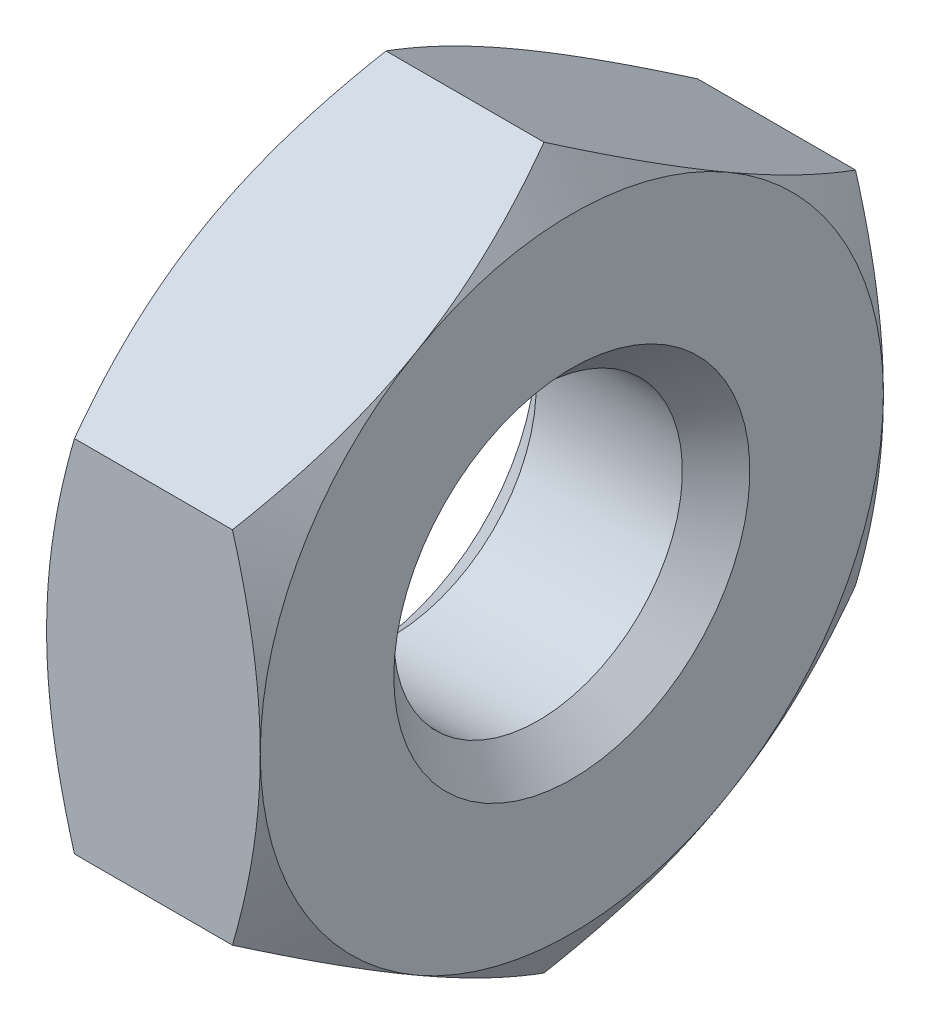
ISO-10303-21;
HEADER;
FILE_DESCRIPTION(('STEP AP214'),'2;1');
FILE_NAME('part.step','',(''),(''),'','','');
FILE_SCHEMA(('AUTOMOTIVE_DESIGN { 1 0 10303 214 1 1 1 1 }'));
ENDSEC;
DATA;
#1=APPLICATION_CONTEXT('core data for automotive mechanical design processes');
#2=APPLICATION_PROTOCOL_DEFINITION('international standard','automotive_design',2000,#1);
#3=PRODUCT_CONTEXT('',#1,'mechanical');
#4=PRODUCT('Part','Part','',(#3));
#5=PRODUCT_RELATED_PRODUCT_CATEGORY('part','',(#4));
#6=PRODUCT_DEFINITION_FORMATION('','',#4);
#7=PRODUCT_DEFINITION_CONTEXT('part definition',#1,'design');
#8=PRODUCT_DEFINITION('design','',#6,#7);
#9=PRODUCT_DEFINITION_SHAPE('','',#8);
#10=(LENGTH_UNIT() NAMED_UNIT(*) SI_UNIT(.MILLI.,.METRE.));
#11=(NAMED_UNIT(*) PLANE_ANGLE_UNIT() SI_UNIT($,.RADIAN.));
#12=(NAMED_UNIT(*) SI_UNIT($,.STERADIAN.) SOLID_ANGLE_UNIT());
#13=UNCERTAINTY_MEASURE_WITH_UNIT(LENGTH_MEASURE(1.E-05),#10,'distance_accuracy_value','');
#14=(GEOMETRIC_REPRESENTATION_CONTEXT(3) GLOBAL_UNCERTAINTY_ASSIGNED_CONTEXT((#13)) GLOBAL_UNIT_ASSIGNED_CONTEXT((#10,
#11,#12)) REPRESENTATION_CONTEXT('',''));
#15=CARTESIAN_POINT('',(0.,0.,0.));
#16=DIRECTION('',(0.,0.,1.));
#17=DIRECTION('',(1.,0.,0.));
#18=AXIS2_PLACEMENT_3D('',#15,#16,#17);
#19=CARTESIAN_POINT('',(-1.2,0.,0.));
#20=DIRECTION('',(1.,0.,0.));
#21=DIRECTION('',(0.,0.,-1.));
#22=AXIS2_PLACEMENT_3D('',#19,#20,#21);
#23=PLANE('',#22);
#24=CARTESIAN_POINT('',(-1.2,0.,0.));
#25=DIRECTION('',(-1.,0.,0.));
#26=DIRECTION('',(0.,0.,1.));
#27=AXIS2_PLACEMENT_3D('',#24,#25,#26);
#28=CIRCLE('',#27,3.5);
#29=CARTESIAN_POINT('',(-1.2,0.,3.5));
#30=VERTEX_POINT('',#29);
#31=CARTESIAN_POINT('',(-1.2,3.03108891324554,1.75));
#32=VERTEX_POINT('',#31);
#33=EDGE_CURVE('E11',#30,#32,#28,.T.);
#34=ORIENTED_EDGE('',*,*,#33,.T.);
#35=CARTESIAN_POINT('',(-1.2,3.03108891324554,-1.75));
#36=VERTEX_POINT('',#35);
#37=EDGE_CURVE('E43',#32,#36,#28,.T.);
#38=ORIENTED_EDGE('',*,*,#37,.T.);
#39=CARTESIAN_POINT('',(-1.2,0.,-3.5));
#40=VERTEX_POINT('',#39);
#41=EDGE_CURVE('E339',#36,#40,#28,.T.);
#42=ORIENTED_EDGE('',*,*,#41,.T.);
#43=CARTESIAN_POINT('',(-1.2,-3.03108891324554,-1.75));
#44=VERTEX_POINT('',#43);
#45=EDGE_CURVE('E337',#40,#44,#28,.T.);
#46=ORIENTED_EDGE('',*,*,#45,.T.);
#47=CARTESIAN_POINT('',(-1.2,-3.03108891324554,1.75));
#48=VERTEX_POINT('',#47);
#49=EDGE_CURVE('E332',#44,#48,#28,.T.);
#50=ORIENTED_EDGE('',*,*,#49,.T.);
#51=EDGE_CURVE('E44',#48,#30,#28,.T.);
#52=ORIENTED_EDGE('',*,*,#51,.T.);
#53=EDGE_LOOP('',(#34,#38,#42,#46,#50,#52));
#54=FACE_BOUND('',#53,.T.);
#55=CARTESIAN_POINT('',(-1.2,0.,0.));
#56=DIRECTION('',(-1.,0.,0.));
#57=DIRECTION('',(0.,0.,1.));
#58=AXIS2_PLACEMENT_3D('',#55,#56,#57);
#59=CIRCLE('',#58,2.);
#60=CARTESIAN_POINT('',(-1.2,0.,2.));
#61=VERTEX_POINT('',#60);
#62=EDGE_CURVE('E141',#61,#61,#59,.T.);
#63=ORIENTED_EDGE('',*,*,#62,.F.);
#64=EDGE_LOOP('',(#63));
#65=FACE_BOUND('',#64,.T.);
#66=ADVANCED_FACE('F36',(#54,#65),#23,.F.);
#67=CARTESIAN_POINT('',(1.2,3.5,0.));
#68=DIRECTION('',(-1.,0.,0.));
#69=DIRECTION('',(0.,0.,1.));
#70=AXIS2_PLACEMENT_3D('',#67,#68,#69);
#71=PLANE('',#70);
#72=CARTESIAN_POINT('',(1.2,0.,0.));
#73=DIRECTION('',(-1.,0.,0.));
#74=DIRECTION('',(0.,0.,1.));
#75=AXIS2_PLACEMENT_3D('',#72,#73,#74);
#76=CIRCLE('',#75,3.5);
#77=CARTESIAN_POINT('',(1.2,0.,3.5));
#78=VERTEX_POINT('',#77);
#79=CARTESIAN_POINT('',(1.2,3.03108891324554,1.75));
#80=VERTEX_POINT('',#79);
#81=EDGE_CURVE('E288',#78,#80,#76,.T.);
#82=ORIENTED_EDGE('',*,*,#81,.F.);
#83=CARTESIAN_POINT('',(1.2,-3.03108891324554,1.75));
#84=VERTEX_POINT('',#83);
#85=EDGE_CURVE('E278',#84,#78,#76,.T.);
#86=ORIENTED_EDGE('',*,*,#85,.F.);
#87=CARTESIAN_POINT('',(1.2,-3.03108891324554,-1.75));
#88=VERTEX_POINT('',#87);
#89=EDGE_CURVE('E284',#88,#84,#76,.T.);
#90=ORIENTED_EDGE('',*,*,#89,.F.);
#91=CARTESIAN_POINT('',(1.2,0.,-3.5));
#92=VERTEX_POINT('',#91);
#93=EDGE_CURVE('E290',#92,#88,#76,.T.);
#94=ORIENTED_EDGE('',*,*,#93,.F.);
#95=CARTESIAN_POINT('',(1.2,3.03108891324554,-1.75));
#96=VERTEX_POINT('',#95);
#97=EDGE_CURVE('E291',#96,#92,#76,.T.);
#98=ORIENTED_EDGE('',*,*,#97,.F.);
#99=EDGE_CURVE('E292',#80,#96,#76,.T.);
#100=ORIENTED_EDGE('',*,*,#99,.F.);
#101=EDGE_LOOP('',(#82,#86,#90,#94,#98,#100));
#102=FACE_BOUND('',#101,.T.);
#103=CARTESIAN_POINT('',(1.2,0.,0.));
#104=DIRECTION('',(-1.,0.,0.));
#105=DIRECTION('',(0.,0.,1.));
#106=AXIS2_PLACEMENT_3D('',#103,#104,#105);
#107=CIRCLE('',#106,2.);
#108=CARTESIAN_POINT('',(1.2,0.,2.));
#109=VERTEX_POINT('',#108);
#110=EDGE_CURVE('E620',#109,#109,#107,.T.);
#111=ORIENTED_EDGE('',*,*,#110,.T.);
#112=EDGE_LOOP('',(#111));
#113=FACE_BOUND('',#112,.T.);
#114=ADVANCED_FACE('F172',(#102,#113),#71,.F.);
#115=CARTESIAN_POINT('',(-0.795854811567261,0.,0.));
#116=DIRECTION('',(1.,0.,0.));
#117=DIRECTION('',(0.,0.,-1.));
#118=AXIS2_PLACEMENT_3D('',#115,#116,#117);
#119=CONICAL_SURFACE('',#118,4.2,1.0471975511966);
#120=CARTESIAN_POINT('',(0.480988086259848,-5.37196986632305,-3.5));
#121=CARTESIAN_POINT('',(0.407283508786786,-5.21956229872807,-3.5));
#122=CARTESIAN_POINT('',(0.334302028621978,-5.06679879227545,-3.5));
#123=CARTESIAN_POINT('',(0.190193119787068,-4.7603703949844,-3.5));
#124=CARTESIAN_POINT('',(0.119065994901097,-4.60670536144476,-3.5));
#125=CARTESIAN_POINT('',(-0.0212962646167795,-4.29746545873837,-3.5));
#126=CARTESIAN_POINT('',(-0.0905184858942326,-4.14188470744051,-3.5));
#127=CARTESIAN_POINT('',(-0.226054294481621,-3.82946600083052,-3.5));
#128=CARTESIAN_POINT('',(-0.292368023157458,-3.67262810706043,-3.5));
#129=CARTESIAN_POINT('',(-0.423298105104402,-3.35260353945911,-3.5));
#130=CARTESIAN_POINT('',(-0.487799913704983,-3.18936973939843,-3.5));
#131=CARTESIAN_POINT('',(-0.611784853293828,-2.8609718128924,-3.5));
#132=CARTESIAN_POINT('',(-0.671267413299659,-2.69580746925786,-3.5));
#133=CARTESIAN_POINT('',(-0.783611168590104,-2.36361344486693,-3.5));
#134=CARTESIAN_POINT('',(-0.836486267944157,-2.19658851504802,-3.5));
#135=CARTESIAN_POINT('',(-0.933881607500532,-1.860143848,-3.5));
#136=CARTESIAN_POINT('',(-0.97840453942322,-1.69072490130334,-3.5));
#137=CARTESIAN_POINT('',(-1.05668874987123,-1.35032578084445,-3.5));
#138=CARTESIAN_POINT('',(-1.09050625247354,-1.17935878378483,-3.5));
#139=CARTESIAN_POINT('',(-1.1454299454845,-0.835358711580522,-3.5));
#140=CARTESIAN_POINT('',(-1.16653722800651,-0.662325815249527,-3.5));
#141=CARTESIAN_POINT('',(-1.19407939926803,-0.317293925963925,-3.5));
#142=CARTESIAN_POINT('',(-1.20069844646934,-0.145310003142864,-3.5));
#143=CARTESIAN_POINT('',(-1.19918442101375,0.198604964977063,-3.5));
#144=CARTESIAN_POINT('',(-1.19105094478675,0.370536008700681,-3.5));
#145=CARTESIAN_POINT('',(-1.16513400901782,0.664116489402586,-3.5));
#146=CARTESIAN_POINT('',(-1.15077510101717,0.786085309438428,-3.5));
#147=CARTESIAN_POINT('',(-1.11555791787667,1.02908758010431,-3.5));
#148=CARTESIAN_POINT('',(-1.09469871046115,1.15012089401034,-3.5));
#149=CARTESIAN_POINT('',(-1.02347160339957,1.51168058473927,-3.5));
#150=CARTESIAN_POINT('',(-0.964468594491871,1.75052251621997,-3.5));
#151=CARTESIAN_POINT('',(-0.862699530257054,2.10757914173379,-3.5));
#152=CARTESIAN_POINT('',(-0.826106263684609,2.22765807986732,-3.5));
#153=CARTESIAN_POINT('',(-0.749254921128682,2.46664869406854,-3.5));
#154=CARTESIAN_POINT('',(-0.708996821775749,2.58556036268759,-3.5));
#155=CARTESIAN_POINT('',(-0.625450515881703,2.82225678707793,-3.5));
#156=CARTESIAN_POINT('',(-0.582163398110058,2.94004193064585,-3.5));
#157=CARTESIAN_POINT('',(-0.493054458105272,3.17464554572882,-3.5));
#158=CARTESIAN_POINT('',(-0.447232659301594,3.29146402616782,-3.5));
#159=CARTESIAN_POINT('',(-0.340420409465957,3.55666494412485,-3.5));
#160=CARTESIAN_POINT('',(-0.278759648230463,3.70477685888708,-3.5));
#161=CARTESIAN_POINT('',(-0.152676639626143,3.99982322200438,-3.5));
#162=CARTESIAN_POINT('',(-0.0882542590232543,4.14675761314309,-3.5));
#163=CARTESIAN_POINT('',(0.108341413973783,4.58612473076338,-3.5));
#164=CARTESIAN_POINT('',(0.243824188724422,4.87707514102806,-3.5));
#165=CARTESIAN_POINT('',(0.520760366823535,5.45640845489744,-3.5));
#166=CARTESIAN_POINT('',(0.662218955769723,5.74478885423415,-3.5));
#167=CARTESIAN_POINT('',(0.949225393039628,6.31951440902778,-3.5));
#168=CARTESIAN_POINT('',(1.09477337670376,6.60585949673122,-3.5));
#169=CARTESIAN_POINT('',(1.37734405966205,7.15478235363293,-3.5));
#170=CARTESIAN_POINT('',(1.51414731094802,7.41747346198053,-3.5));
#171=CARTESIAN_POINT('',(1.78964637345324,7.94187006515259,-3.5));
#172=CARTESIAN_POINT('',(1.92834223976776,8.20357553100017,-3.5));
#173=CARTESIAN_POINT('',(2.20688099780863,8.72563501839554,-3.5));
#174=CARTESIAN_POINT('',(2.34672069593944,8.98599074633557,-3.5));
#175=CARTESIAN_POINT('',(2.62754959638331,9.50606534442601,-3.5));
#176=CARTESIAN_POINT('',(2.76853874214416,9.76578424509992,-3.5));
#177=CARTESIAN_POINT('',(2.90996058564116,10.0252656776079,-3.5));
#178=B_SPLINE_CURVE_WITH_KNOTS('',3,(#120,#121,#122,#123,#124,#125,#126,#127,#128,#129,#130,
#131,#132,#133,#134,#135,#136,#137,#138,#139,#140,#141,#142,#143,#144,#145,#146,#147,#148,#149,
#150,#151,#152,#153,#154,#155,#156,#157,#158,#159,#160,#161,#162,#163,#164,#165,#166,#167,#168,
#169,#170,#171,#172,#173,#174,#175,#176,#177),.UNSPECIFIED.,.F.,.F.,(4,2,2,2,2,2,2,2,2,2,2,2,2,
2,2,2,2,2,2,2,2,2,2,2,2,2,2,2,4),(0.,0.507888246703566,1.01585918038805,1.52669129945674,
2.03749856219543,2.56398187130408,3.09052499187288,3.61594075148652,4.14118688912341,
4.66362686194865,5.18602193821682,5.70173737934552,6.21746692860129,6.58572052685437,
6.95402696451952,7.69107260984486,8.06763539279987,8.44420057714208,8.82063109500092,
9.19705813388496,9.67832437928781,10.1596138695236,11.1223428649373,12.0859251699099,
13.0495394027373,13.9380661095811,14.8266187374343,15.7132171301892,16.5997721628952),.UNSPECIFIED.);
#179=CARTESIAN_POINT('',(-0.887392608830356,-2.02072594216369,-3.5));
#180=VERTEX_POINT('',#179);
#181=EDGE_CURVE('E348',#180,#40,#178,.T.);
#182=ORIENTED_EDGE('',*,*,#181,.F.);
#183=CARTESIAN_POINT('',(-0.887325939306629,-4.04156735438122,0.000200000000000053));
#184=CARTESIAN_POINT('',(-0.938614211010016,-3.9527667384984,-0.15360717845245));
#185=CARTESIAN_POINT('',(-0.985259046183803,-3.86319960126198,-0.308742010834424));
#186=CARTESIAN_POINT('',(-1.06667812446665,-3.68251437287562,-0.621698006576781));
#187=CARTESIAN_POINT('',(-1.10142356441544,-3.59139307116725,-0.779524730787496));
#188=CARTESIAN_POINT('',(-1.15550997281716,-3.41027974688034,-1.09322221038013));
#189=CARTESIAN_POINT('',(-1.17521091373962,-3.32031559103708,-1.24904469916069));
#190=CARTESIAN_POINT('',(-1.19872986726275,-3.13996396008051,-1.56142288720537));
#191=CARTESIAN_POINT('',(-1.20256735545444,-3.04957714051106,-1.71797745103423));
#192=CARTESIAN_POINT('',(-1.19458469812302,-2.88068384499777,-2.01050921992099));
#193=CARTESIAN_POINT('',(-1.18472456593039,-2.80215208834114,-2.14653021245791));
#194=CARTESIAN_POINT('',(-1.1534735331006,-2.64560020969753,-2.417686020289));
#195=CARTESIAN_POINT('',(-1.1320719567142,-2.5675806292065,-2.55281989768468));
#196=CARTESIAN_POINT('',(-1.07856959211942,-2.41070596159678,-2.82453479240518));
#197=CARTESIAN_POINT('',(-1.04624200555491,-2.33187072981463,-2.96108141927834));
#198=CARTESIAN_POINT('',(-0.972871066192005,-2.17537608630783,-3.2321380929445));
#199=CARTESIAN_POINT('',(-0.931844953430133,-2.09771466960098,-3.36665161246854));
#200=CARTESIAN_POINT('',(-0.887325939306629,-2.02061047210985,-3.5002));
#201=B_SPLINE_CURVE_WITH_KNOTS('',3,(#183,#184,#185,#186,#187,#188,#189,#190,#191,#192,#193,
#194,#195,#196,#197,#198,#199,#200),.UNSPECIFIED.,.F.,.F.,(4,2,2,2,2,2,2,2,4),(0.,
0.554793832886254,1.11092123814984,1.65328467083219,2.19498204478403,2.6666513085086,
3.13875761298267,3.6213361260051,4.10296698719187),.UNSPECIFIED.);
#202=EDGE_CURVE('E190',#44,#180,#201,.T.);
#203=ORIENTED_EDGE('',*,*,#202,.F.);
#204=ORIENTED_EDGE('',*,*,#45,.F.);
#205=EDGE_LOOP('',(#182,#203,#204));
#206=FACE_BOUND('',#205,.T.);
#207=ADVANCED_FACE('F168',(#206),#119,.T.);
#208=CARTESIAN_POINT('',(-0.887392608830356,2.02072594216369,-3.5));
#209=VERTEX_POINT('',#208);
#210=EDGE_CURVE('E198',#40,#209,#178,.T.);
#211=ORIENTED_EDGE('',*,*,#210,.F.);
#212=ORIENTED_EDGE('',*,*,#41,.F.);
#213=CARTESIAN_POINT('',(-0.887325939306629,2.02061047210985,-3.5002));
#214=CARTESIAN_POINT('',(-0.938614211010017,2.10941108799267,-3.34639282154755));
#215=CARTESIAN_POINT('',(-0.985259046183803,2.19897822522909,-3.19125798916558));
#216=CARTESIAN_POINT('',(-1.06667812446665,2.37966345361545,-2.87830199342322));
#217=CARTESIAN_POINT('',(-1.10142356441544,2.47078475532382,-2.7204752692125));
#218=CARTESIAN_POINT('',(-1.15550997281716,2.65189807961073,-2.40677778961987));
#219=CARTESIAN_POINT('',(-1.17521091373962,2.74186223545399,-2.25095530083931));
#220=CARTESIAN_POINT('',(-1.19872986726275,2.92221386641056,-1.93857711279463));
#221=CARTESIAN_POINT('',(-1.20256735545444,3.01260068598001,-1.78202254896577));
#222=CARTESIAN_POINT('',(-1.19458469812302,3.1814939814933,-1.48949078007901));
#223=CARTESIAN_POINT('',(-1.18472456593039,3.26002573814993,-1.35346978754209));
#224=CARTESIAN_POINT('',(-1.1534735331006,3.41657761679354,-1.08231397971101));
#225=CARTESIAN_POINT('',(-1.1320719567142,3.49459719728458,-0.947180102315317));
#226=CARTESIAN_POINT('',(-1.07856959211942,3.65147186489429,-0.675465207594816));
#227=CARTESIAN_POINT('',(-1.04624200555491,3.73030709667644,-0.538918580721664));
#228=CARTESIAN_POINT('',(-0.972871066192006,3.88680174018324,-0.267861907055498));
#229=CARTESIAN_POINT('',(-0.931844953430133,3.96446315689009,-0.133348387531463));
#230=CARTESIAN_POINT('',(-0.887325939306629,4.04156735438122,0.000199999999999892));
#231=B_SPLINE_CURVE_WITH_KNOTS('',3,(#213,#214,#215,#216,#217,#218,#219,#220,#221,#222,#223,
#224,#225,#226,#227,#228,#229,#230),.UNSPECIFIED.,.F.,.F.,(4,2,2,2,2,2,2,2,4),(0.,
0.554793832886254,1.11092123814984,1.65328467083219,2.19498204478403,2.6666513085086,
3.13875761298267,3.6213361260051,4.10296698719187),.UNSPECIFIED.);
#232=EDGE_CURVE('E213',#209,#36,#231,.T.);
#233=ORIENTED_EDGE('',*,*,#232,.F.);
#234=EDGE_LOOP('',(#211,#212,#233));
#235=FACE_BOUND('',#234,.T.);
#236=ADVANCED_FACE('F171',(#235),#119,.T.);
#237=CARTESIAN_POINT('',(-0.887392608830357,4.04145188432738,0.));
#238=VERTEX_POINT('',#237);
#239=EDGE_CURVE('E206',#36,#238,#231,.T.);
#240=ORIENTED_EDGE('',*,*,#239,.F.);
#241=ORIENTED_EDGE('',*,*,#37,.F.);
#242=CARTESIAN_POINT('',(-0.887325939306629,4.04156735438122,-0.000200000000000053));
#243=CARTESIAN_POINT('',(-0.938614211010016,3.9527667384984,0.15360717845245));
#244=CARTESIAN_POINT('',(-0.985259046183803,3.86319960126198,0.308742010834424));
#245=CARTESIAN_POINT('',(-1.06667812446665,3.68251437287562,0.621698006576781));
#246=CARTESIAN_POINT('',(-1.10142356441544,3.59139307116725,0.779524730787496));
#247=CARTESIAN_POINT('',(-1.15550997281716,3.41027974688034,1.09322221038013));
#248=CARTESIAN_POINT('',(-1.17521091373962,3.32031559103708,1.24904469916069));
#249=CARTESIAN_POINT('',(-1.19872986726275,3.13996396008051,1.56142288720537));
#250=CARTESIAN_POINT('',(-1.20256735545444,3.04957714051106,1.71797745103423));
#251=CARTESIAN_POINT('',(-1.19458469812302,2.88068384499777,2.01050921992099));
#252=CARTESIAN_POINT('',(-1.18472456593039,2.80215208834114,2.14653021245791));
#253=CARTESIAN_POINT('',(-1.1534735331006,2.64560020969753,2.417686020289));
#254=CARTESIAN_POINT('',(-1.1320719567142,2.5675806292065,2.55281989768468));
#255=CARTESIAN_POINT('',(-1.07856959211942,2.41070596159678,2.82453479240518));
#256=CARTESIAN_POINT('',(-1.04624200555491,2.33187072981463,2.96108141927834));
#257=CARTESIAN_POINT('',(-0.972871066192005,2.17537608630783,3.2321380929445));
#258=CARTESIAN_POINT('',(-0.931844953430133,2.09771466960098,3.36665161246854));
#259=CARTESIAN_POINT('',(-0.887325939306629,2.02061047210985,3.5002));
#260=B_SPLINE_CURVE_WITH_KNOTS('',3,(#242,#243,#244,#245,#246,#247,#248,#249,#250,#251,#252,
#253,#254,#255,#256,#257,#258,#259),.UNSPECIFIED.,.F.,.F.,(4,2,2,2,2,2,2,2,4),(0.,
0.554793832886254,1.11092123814984,1.65328467083219,2.19498204478403,2.6666513085086,
3.13875761298267,3.6213361260051,4.10296698719187),.UNSPECIFIED.);
#261=EDGE_CURVE('E132',#238,#32,#260,.T.);
#262=ORIENTED_EDGE('',*,*,#261,.F.);
#263=EDGE_LOOP('',(#240,#241,#262));
#264=FACE_BOUND('',#263,.T.);
#265=ADVANCED_FACE('F343',(#264),#119,.T.);
#266=CARTESIAN_POINT('',(-0.887392608830357,-4.04145188432738,0.));
#267=VERTEX_POINT('',#266);
#268=EDGE_CURVE('E246',#267,#44,#201,.T.);
#269=ORIENTED_EDGE('',*,*,#268,.F.);
#270=CARTESIAN_POINT('',(-0.887325939306629,-2.02061047210985,3.5002));
#271=CARTESIAN_POINT('',(-0.938614211010017,-2.10941108799267,3.34639282154755));
#272=CARTESIAN_POINT('',(-0.985259046183803,-2.19897822522909,3.19125798916558));
#273=CARTESIAN_POINT('',(-1.06667812446665,-2.37966345361545,2.87830199342322));
#274=CARTESIAN_POINT('',(-1.10142356441544,-2.47078475532382,2.7204752692125));
#275=CARTESIAN_POINT('',(-1.15550997281716,-2.65189807961073,2.40677778961987));
#276=CARTESIAN_POINT('',(-1.17521091373962,-2.74186223545399,2.25095530083931));
#277=CARTESIAN_POINT('',(-1.19872986726275,-2.92221386641056,1.93857711279463));
#278=CARTESIAN_POINT('',(-1.20256735545444,-3.01260068598001,1.78202254896577));
#279=CARTESIAN_POINT('',(-1.19458469812302,-3.1814939814933,1.48949078007901));
#280=CARTESIAN_POINT('',(-1.18472456593039,-3.26002573814993,1.35346978754209));
#281=CARTESIAN_POINT('',(-1.1534735331006,-3.41657761679354,1.08231397971101));
#282=CARTESIAN_POINT('',(-1.1320719567142,-3.49459719728458,0.947180102315317));
#283=CARTESIAN_POINT('',(-1.07856959211942,-3.65147186489429,0.675465207594816));
#284=CARTESIAN_POINT('',(-1.04624200555491,-3.73030709667644,0.538918580721664));
#285=CARTESIAN_POINT('',(-0.972871066192006,-3.88680174018324,0.267861907055498));
#286=CARTESIAN_POINT('',(-0.931844953430133,-3.96446315689009,0.133348387531463));
#287=CARTESIAN_POINT('',(-0.887325939306629,-4.04156735438122,-0.000199999999999892));
#288=B_SPLINE_CURVE_WITH_KNOTS('',3,(#270,#271,#272,#273,#274,#275,#276,#277,#278,#279,#280,
#281,#282,#283,#284,#285,#286,#287),.UNSPECIFIED.,.F.,.F.,(4,2,2,2,2,2,2,2,4),(0.,
0.554793832886254,1.11092123814984,1.65328467083219,2.19498204478403,2.6666513085086,
3.13875761298267,3.6213361260051,4.10296698719187),.UNSPECIFIED.);
#289=EDGE_CURVE('E182',#48,#267,#288,.T.);
#290=ORIENTED_EDGE('',*,*,#289,.F.);
#291=ORIENTED_EDGE('',*,*,#49,.F.);
#292=EDGE_LOOP('',(#269,#290,#291));
#293=FACE_BOUND('',#292,.T.);
#294=ADVANCED_FACE('F447',(#293),#119,.T.);
#295=CARTESIAN_POINT('',(-0.887392608830356,2.02072594216369,3.5));
#296=VERTEX_POINT('',#295);
#297=EDGE_CURVE('E126',#32,#296,#260,.T.);
#298=ORIENTED_EDGE('',*,*,#297,.F.);
#299=ORIENTED_EDGE('',*,*,#33,.F.);
#300=CARTESIAN_POINT('',(0.480988086259848,-5.37196986632305,3.5));
#301=CARTESIAN_POINT('',(0.407283508786786,-5.21956229872807,3.5));
#302=CARTESIAN_POINT('',(0.334302028621978,-5.06679879227545,3.5));
#303=CARTESIAN_POINT('',(0.190193119787068,-4.7603703949844,3.5));
#304=CARTESIAN_POINT('',(0.119065994901097,-4.60670536144476,3.5));
#305=CARTESIAN_POINT('',(-0.0212962646167795,-4.29746545873837,3.5));
#306=CARTESIAN_POINT('',(-0.0905184858942326,-4.14188470744051,3.5));
#307=CARTESIAN_POINT('',(-0.226054294481621,-3.82946600083052,3.5));
#308=CARTESIAN_POINT('',(-0.292368023157458,-3.67262810706043,3.5));
#309=CARTESIAN_POINT('',(-0.423298105104402,-3.35260353945911,3.5));
#310=CARTESIAN_POINT('',(-0.487799913704983,-3.18936973939843,3.5));
#311=CARTESIAN_POINT('',(-0.611784853293828,-2.8609718128924,3.5));
#312=CARTESIAN_POINT('',(-0.671267413299659,-2.69580746925786,3.5));
#313=CARTESIAN_POINT('',(-0.783611168590104,-2.36361344486693,3.5));
#314=CARTESIAN_POINT('',(-0.836486267944157,-2.19658851504802,3.5));
#315=CARTESIAN_POINT('',(-0.933881607500532,-1.860143848,3.5));
#316=CARTESIAN_POINT('',(-0.97840453942322,-1.69072490130334,3.5));
#317=CARTESIAN_POINT('',(-1.05668874987123,-1.35032578084445,3.5));
#318=CARTESIAN_POINT('',(-1.09050625247354,-1.17935878378483,3.5));
#319=CARTESIAN_POINT('',(-1.1454299454845,-0.835358711580522,3.5));
#320=CARTESIAN_POINT('',(-1.16653722800651,-0.662325815249527,3.5));
#321=CARTESIAN_POINT('',(-1.19407939926803,-0.317293925963925,3.5));
#322=CARTESIAN_POINT('',(-1.20069844646934,-0.145310003142864,3.5));
#323=CARTESIAN_POINT('',(-1.19918442101375,0.198604964977063,3.5));
#324=CARTESIAN_POINT('',(-1.19105094478675,0.370536008700681,3.5));
#325=CARTESIAN_POINT('',(-1.16513400901782,0.664116489402586,3.5));
#326=CARTESIAN_POINT('',(-1.15077510101717,0.786085309438428,3.5));
#327=CARTESIAN_POINT('',(-1.11555791787667,1.02908758010431,3.5));
#328=CARTESIAN_POINT('',(-1.09469871046115,1.15012089401034,3.5));
#329=CARTESIAN_POINT('',(-1.02347160339957,1.51168058473927,3.5));
#330=CARTESIAN_POINT('',(-0.964468594491871,1.75052251621997,3.5));
#331=CARTESIAN_POINT('',(-0.862699530257054,2.10757914173379,3.5));
#332=CARTESIAN_POINT('',(-0.826106263684609,2.22765807986732,3.5));
#333=CARTESIAN_POINT('',(-0.749254921128682,2.46664869406854,3.5));
#334=CARTESIAN_POINT('',(-0.708996821775749,2.58556036268759,3.5));
#335=CARTESIAN_POINT('',(-0.625450515881703,2.82225678707793,3.5));
#336=CARTESIAN_POINT('',(-0.582163398110058,2.94004193064585,3.5));
#337=CARTESIAN_POINT('',(-0.493054458105272,3.17464554572882,3.5));
#338=CARTESIAN_POINT('',(-0.447232659301594,3.29146402616782,3.5));
#339=CARTESIAN_POINT('',(-0.340420409465957,3.55666494412485,3.5));
#340=CARTESIAN_POINT('',(-0.278759648230463,3.70477685888708,3.5));
#341=CARTESIAN_POINT('',(-0.152676639626143,3.99982322200438,3.5));
#342=CARTESIAN_POINT('',(-0.0882542590232543,4.14675761314309,3.5));
#343=CARTESIAN_POINT('',(0.108341413973783,4.58612473076338,3.5));
#344=CARTESIAN_POINT('',(0.243824188724422,4.87707514102806,3.5));
#345=CARTESIAN_POINT('',(0.520760366823535,5.45640845489744,3.5));
#346=CARTESIAN_POINT('',(0.662218955769723,5.74478885423415,3.5));
#347=CARTESIAN_POINT('',(0.949225393039628,6.31951440902778,3.5));
#348=CARTESIAN_POINT('',(1.09477337670376,6.60585949673122,3.5));
#349=CARTESIAN_POINT('',(1.37734405966205,7.15478235363293,3.5));
#350=CARTESIAN_POINT('',(1.51414731094802,7.41747346198053,3.5));
#351=CARTESIAN_POINT('',(1.78964637345324,7.94187006515259,3.5));
#352=CARTESIAN_POINT('',(1.92834223976776,8.20357553100017,3.5));
#353=CARTESIAN_POINT('',(2.20688099780863,8.72563501839554,3.5));
#354=CARTESIAN_POINT('',(2.34672069593944,8.98599074633557,3.5));
#355=CARTESIAN_POINT('',(2.62754959638331,9.50606534442601,3.5));
#356=CARTESIAN_POINT('',(2.76853874214416,9.76578424509992,3.5));
#357=CARTESIAN_POINT('',(2.90996058564116,10.0252656776079,3.5));
#358=B_SPLINE_CURVE_WITH_KNOTS('',3,(#300,#301,#302,#303,#304,#305,#306,#307,#308,#309,#310,
#311,#312,#313,#314,#315,#316,#317,#318,#319,#320,#321,#322,#323,#324,#325,#326,#327,#328,#329,
#330,#331,#332,#333,#334,#335,#336,#337,#338,#339,#340,#341,#342,#343,#344,#345,#346,#347,#348,
#349,#350,#351,#352,#353,#354,#355,#356,#357),.UNSPECIFIED.,.F.,.F.,(4,2,2,2,2,2,2,2,2,2,2,2,2,
2,2,2,2,2,2,2,2,2,2,2,2,2,2,2,4),(0.,0.507888246703566,1.01585918038805,1.52669129945674,
2.03749856219543,2.56398187130408,3.09052499187288,3.61594075148652,4.14118688912341,
4.66362686194865,5.18602193821682,5.70173737934552,6.21746692860129,6.58572052685437,
6.95402696451952,7.69107260984486,8.06763539279987,8.44420057714208,8.82063109500092,
9.19705813388496,9.67832437928781,10.1596138695236,11.1223428649373,12.0859251699099,
13.0495394027373,13.9380661095811,14.8266187374343,15.7132171301892,16.5997721628952),.UNSPECIFIED.);
#359=EDGE_CURVE('E51',#296,#30,#358,.F.);
#360=ORIENTED_EDGE('',*,*,#359,.F.);
#361=EDGE_LOOP('',(#298,#299,#360));
#362=FACE_BOUND('',#361,.T.);
#363=ADVANCED_FACE('F143',(#362),#119,.T.);
#364=CARTESIAN_POINT('',(-0.887392608830356,-2.02072594216369,3.5));
#365=VERTEX_POINT('',#364);
#366=EDGE_CURVE('E258',#365,#48,#288,.T.);
#367=ORIENTED_EDGE('',*,*,#366,.F.);
#368=EDGE_CURVE('E145',#30,#365,#358,.F.);
#369=ORIENTED_EDGE('',*,*,#368,.F.);
#370=ORIENTED_EDGE('',*,*,#51,.F.);
#371=EDGE_LOOP('',(#367,#369,#370));
#372=FACE_BOUND('',#371,.T.);
#373=ADVANCED_FACE('F174',(#372),#119,.T.);
#374=CARTESIAN_POINT('',(-2.4,4.04145188432738,0.));
#375=DIRECTION('',(0.,0.866025403784439,0.5));
#376=DIRECTION('',(0.,-0.5,0.866025403784439));
#377=AXIS2_PLACEMENT_3D('',#374,#375,#376);
#378=PLANE('',#377);
#379=ORIENTED_EDGE('',*,*,#261,.T.);
#380=ORIENTED_EDGE('',*,*,#297,.T.);
#381=DIRECTION('',(1.,0.,0.));
#382=VECTOR('',#381,1.);
#383=CARTESIAN_POINT('',(-2.4,2.02072594216369,3.5));
#384=LINE('',#383,#382);
#385=CARTESIAN_POINT('',(0.887392608830357,2.02072594216369,3.5));
#386=VERTEX_POINT('',#385);
#387=EDGE_CURVE('E128',#296,#386,#384,.T.);
#388=ORIENTED_EDGE('',*,*,#387,.T.);
#389=CARTESIAN_POINT('',(0.887325939306629,2.02061047210985,3.5002));
#390=CARTESIAN_POINT('',(0.938614211010017,2.10941108799267,3.34639282154755));
#391=CARTESIAN_POINT('',(0.985259046183803,2.19897822522909,3.19125798916558));
#392=CARTESIAN_POINT('',(1.06667812446665,2.37966345361545,2.87830199342322));
#393=CARTESIAN_POINT('',(1.10142356441544,2.47078475532382,2.7204752692125));
#394=CARTESIAN_POINT('',(1.15550997281716,2.65189807961073,2.40677778961987));
#395=CARTESIAN_POINT('',(1.17521091373962,2.74186223545399,2.25095530083931));
#396=CARTESIAN_POINT('',(1.19872986726275,2.92221386641056,1.93857711279463));
#397=CARTESIAN_POINT('',(1.20256735545444,3.01260068598001,1.78202254896577));
#398=CARTESIAN_POINT('',(1.19458469812302,3.1814939814933,1.48949078007901));
#399=CARTESIAN_POINT('',(1.18472456593039,3.26002573814993,1.35346978754209));
#400=CARTESIAN_POINT('',(1.1534735331006,3.41657761679354,1.082313979711));
#401=CARTESIAN_POINT('',(1.1320719567142,3.49459719728458,0.947180102315317));
#402=CARTESIAN_POINT('',(1.07856959211942,3.65147186489429,0.675465207594816));
#403=CARTESIAN_POINT('',(1.04624200555491,3.73030709667644,0.538918580721664));
#404=CARTESIAN_POINT('',(0.972871066192006,3.88680174018324,0.267861907055498));
#405=CARTESIAN_POINT('',(0.931844953430134,3.96446315689009,0.133348387531464));
#406=CARTESIAN_POINT('',(0.88732593930663,4.04156735438122,-0.000200000000000067));
#407=B_SPLINE_CURVE_WITH_KNOTS('',3,(#389,#390,#391,#392,#393,#394,#395,#396,#397,#398,#399,
#400,#401,#402,#403,#404,#405,#406),.UNSPECIFIED.,.F.,.F.,(4,2,2,2,2,2,2,2,4),(0.,
0.554793832886254,1.11092123814984,1.65328467083219,2.19498204478403,2.6666513085086,
3.13875761298267,3.6213361260051,4.10296698719187),.UNSPECIFIED.);
#408=EDGE_CURVE('E136',#386,#80,#407,.T.);
#409=ORIENTED_EDGE('',*,*,#408,.T.);
#410=CARTESIAN_POINT('',(0.887392608830357,4.04145188432738,0.));
#411=VERTEX_POINT('',#410);
#412=EDGE_CURVE('E220',#80,#411,#407,.T.);
#413=ORIENTED_EDGE('',*,*,#412,.T.);
#414=DIRECTION('',(1.,0.,0.));
#415=VECTOR('',#414,1.);
#416=CARTESIAN_POINT('',(-2.4,4.04145188432738,0.));
#417=LINE('',#416,#415);
#418=EDGE_CURVE('E320',#238,#411,#417,.T.);
#419=ORIENTED_EDGE('',*,*,#418,.F.);
#420=EDGE_LOOP('',(#379,#380,#388,#409,#413,#419));
#421=FACE_BOUND('',#420,.T.);
#422=ADVANCED_FACE('F127',(#421),#378,.T.);
#423=CARTESIAN_POINT('',(-2.4,2.02072594216369,-3.5));
#424=DIRECTION('',(0.,0.866025403784439,-0.5));
#425=DIRECTION('',(0.,0.5,0.866025403784439));
#426=AXIS2_PLACEMENT_3D('',#423,#424,#425);
#427=PLANE('',#426);
#428=ORIENTED_EDGE('',*,*,#232,.T.);
#429=ORIENTED_EDGE('',*,*,#239,.T.);
#430=ORIENTED_EDGE('',*,*,#418,.T.);
#431=CARTESIAN_POINT('',(0.887325939306629,4.04156735438122,0.00019999999999991));
#432=CARTESIAN_POINT('',(0.938614211010017,3.9527667384984,-0.15360717845245));
#433=CARTESIAN_POINT('',(0.985259046183803,3.86319960126198,-0.308742010834424));
#434=CARTESIAN_POINT('',(1.06667812446665,3.68251437287562,-0.621698006576782));
#435=CARTESIAN_POINT('',(1.10142356441544,3.59139307116725,-0.779524730787496));
#436=CARTESIAN_POINT('',(1.15550997281716,3.41027974688034,-1.09322221038013));
#437=CARTESIAN_POINT('',(1.17521091373962,3.32031559103708,-1.24904469916069));
#438=CARTESIAN_POINT('',(1.19872986726275,3.13996396008051,-1.56142288720537));
#439=CARTESIAN_POINT('',(1.20256735545444,3.04957714051106,-1.71797745103423));
#440=CARTESIAN_POINT('',(1.19458469812302,2.88068384499777,-2.01050921992099));
#441=CARTESIAN_POINT('',(1.18472456593039,2.80215208834114,-2.14653021245791));
#442=CARTESIAN_POINT('',(1.1534735331006,2.64560020969753,-2.417686020289));
#443=CARTESIAN_POINT('',(1.1320719567142,2.5675806292065,-2.55281989768468));
#444=CARTESIAN_POINT('',(1.07856959211942,2.41070596159678,-2.82453479240518));
#445=CARTESIAN_POINT('',(1.04624200555491,2.33187072981463,-2.96108141927834));
#446=CARTESIAN_POINT('',(0.972871066192006,2.17537608630783,-3.2321380929445));
#447=CARTESIAN_POINT('',(0.931844953430134,2.09771466960098,-3.36665161246854));
#448=CARTESIAN_POINT('',(0.88732593930663,2.02061047210985,-3.5002));
#449=B_SPLINE_CURVE_WITH_KNOTS('',3,(#431,#432,#433,#434,#435,#436,#437,#438,#439,#440,#441,
#442,#443,#444,#445,#446,#447,#448),.UNSPECIFIED.,.F.,.F.,(4,2,2,2,2,2,2,2,4),(0.,
0.554793832886254,1.11092123814984,1.65328467083219,2.19498204478403,2.6666513085086,
3.13875761298267,3.6213361260051,4.10296698719187),.UNSPECIFIED.);
#450=EDGE_CURVE('E214',#411,#96,#449,.T.);
#451=ORIENTED_EDGE('',*,*,#450,.T.);
#452=CARTESIAN_POINT('',(0.887392608830357,2.02072594216369,-3.5));
#453=VERTEX_POINT('',#452);
#454=EDGE_CURVE('E215',#96,#453,#449,.T.);
#455=ORIENTED_EDGE('',*,*,#454,.T.);
#456=DIRECTION('',(1.,0.,0.));
#457=VECTOR('',#456,1.);
#458=CARTESIAN_POINT('',(-2.4,2.02072594216369,-3.5));
#459=LINE('',#458,#457);
#460=EDGE_CURVE('E323',#209,#453,#459,.T.);
#461=ORIENTED_EDGE('',*,*,#460,.F.);
#462=EDGE_LOOP('',(#428,#429,#430,#451,#455,#461));
#463=FACE_BOUND('',#462,.T.);
#464=ADVANCED_FACE('F225',(#463),#427,.T.);
#465=CARTESIAN_POINT('',(-2.4,-2.02072594216369,-3.5));
#466=DIRECTION('',(0.,0.,-1.));
#467=DIRECTION('',(-1.,0.,0.));
#468=AXIS2_PLACEMENT_3D('',#465,#466,#467);
#469=PLANE('',#468);
#470=ORIENTED_EDGE('',*,*,#181,.T.);
#471=ORIENTED_EDGE('',*,*,#210,.T.);
#472=ORIENTED_EDGE('',*,*,#460,.T.);
#473=CARTESIAN_POINT('',(-0.480988086259846,-5.37196986632305,-3.5));
#474=CARTESIAN_POINT('',(-0.407283508786784,-5.21956229872807,-3.5));
#475=CARTESIAN_POINT('',(-0.334302028621976,-5.06679879227545,-3.5));
#476=CARTESIAN_POINT('',(-0.190193119787066,-4.7603703949844,-3.5));
#477=CARTESIAN_POINT('',(-0.119065994901095,-4.60670536144476,-3.5));
#478=CARTESIAN_POINT('',(0.0212962646167813,-4.29746545873836,-3.5));
#479=CARTESIAN_POINT('',(0.0905184858942343,-4.14188470744051,-3.5));
#480=CARTESIAN_POINT('',(0.226054294481622,-3.82946600083052,-3.5));
#481=CARTESIAN_POINT('',(0.29236802315746,-3.67262810706043,-3.5));
#482=CARTESIAN_POINT('',(0.423298105104403,-3.35260353945911,-3.5));
#483=CARTESIAN_POINT('',(0.487799913704985,-3.18936973939843,-3.5));
#484=CARTESIAN_POINT('',(0.61178485329383,-2.8609718128924,-3.5));
#485=CARTESIAN_POINT('',(0.67126741329966,-2.69580746925786,-3.5));
#486=CARTESIAN_POINT('',(0.783611168590105,-2.36361344486693,-3.5));
#487=CARTESIAN_POINT('',(0.836486267944157,-2.19658851504802,-3.5));
#488=CARTESIAN_POINT('',(0.933881607500533,-1.860143848,-3.5));
#489=CARTESIAN_POINT('',(0.97840453942322,-1.69072490130334,-3.5));
#490=CARTESIAN_POINT('',(1.05668874987123,-1.35032578084445,-3.5));
#491=CARTESIAN_POINT('',(1.09050625247354,-1.17935878378483,-3.5));
#492=CARTESIAN_POINT('',(1.1454299454845,-0.835358711580523,-3.5));
#493=CARTESIAN_POINT('',(1.16653722800651,-0.662325815249528,-3.5));
#494=CARTESIAN_POINT('',(1.19407939926803,-0.317293925963926,-3.5));
#495=CARTESIAN_POINT('',(1.20069844646934,-0.145310003142865,-3.5));
#496=CARTESIAN_POINT('',(1.19918442101375,0.198604964977062,-3.5));
#497=CARTESIAN_POINT('',(1.19105094478675,0.370536008700681,-3.5));
#498=CARTESIAN_POINT('',(1.16513400901782,0.664116489402586,-3.5));
#499=CARTESIAN_POINT('',(1.15077510101717,0.786085309438427,-3.5));
#500=CARTESIAN_POINT('',(1.11555791787667,1.02908758010431,-3.5));
#501=CARTESIAN_POINT('',(1.09469871046115,1.15012089401034,-3.5));
#502=CARTESIAN_POINT('',(1.02347160339958,1.51168058473927,-3.5));
#503=CARTESIAN_POINT('',(0.964468594491871,1.75052251621997,-3.5));
#504=CARTESIAN_POINT('',(0.862699530257055,2.1075791417338,-3.5));
#505=CARTESIAN_POINT('',(0.826106263684609,2.22765807986732,-3.5));
#506=CARTESIAN_POINT('',(0.749254921128683,2.46664869406855,-3.5));
#507=CARTESIAN_POINT('',(0.708996821775749,2.58556036268759,-3.5));
#508=CARTESIAN_POINT('',(0.625450515881702,2.82225678707794,-3.5));
#509=CARTESIAN_POINT('',(0.582163398110058,2.94004193064585,-3.5));
#510=CARTESIAN_POINT('',(0.493054458105272,3.17464554572882,-3.5));
#511=CARTESIAN_POINT('',(0.447232659301593,3.29146402616782,-3.5));
#512=CARTESIAN_POINT('',(0.340420409465957,3.55666494412485,-3.5));
#513=CARTESIAN_POINT('',(0.278759648230464,3.70477685888708,-3.5));
#514=CARTESIAN_POINT('',(0.152676639626144,3.99982322200438,-3.5));
#515=CARTESIAN_POINT('',(0.0882542590232555,4.14675761314309,-3.5));
#516=CARTESIAN_POINT('',(-0.108341413973782,4.58612473076338,-3.5));
#517=CARTESIAN_POINT('',(-0.24382418872442,4.87707514102807,-3.5));
#518=CARTESIAN_POINT('',(-0.520760366823533,5.45640845489745,-3.5));
#519=CARTESIAN_POINT('',(-0.662218955769722,5.74478885423415,-3.5));
#520=CARTESIAN_POINT('',(-0.949225393039627,6.31951440902778,-3.5));
#521=CARTESIAN_POINT('',(-1.09477337670376,6.60585949673122,-3.5));
#522=CARTESIAN_POINT('',(-1.37734405966205,7.15478235363294,-3.5));
#523=CARTESIAN_POINT('',(-1.51414731094802,7.41747346198053,-3.5));
#524=CARTESIAN_POINT('',(-1.78964637345324,7.94187006515259,-3.5));
#525=CARTESIAN_POINT('',(-1.92834223976776,8.20357553100017,-3.5));
#526=CARTESIAN_POINT('',(-2.20688099780863,8.72563501839555,-3.5));
#527=CARTESIAN_POINT('',(-2.34672069593944,8.98599074633557,-3.5));
#528=CARTESIAN_POINT('',(-2.62754959638331,9.50606534442601,-3.5));
#529=CARTESIAN_POINT('',(-2.76853874214416,9.76578424509993,-3.5));
#530=CARTESIAN_POINT('',(-2.90996058564116,10.0252656776079,-3.5));
#531=B_SPLINE_CURVE_WITH_KNOTS('',3,(#473,#474,#475,#476,#477,#478,#479,#480,#481,#482,#483,
#484,#485,#486,#487,#488,#489,#490,#491,#492,#493,#494,#495,#496,#497,#498,#499,#500,#501,#502,
#503,#504,#505,#506,#507,#508,#509,#510,#511,#512,#513,#514,#515,#516,#517,#518,#519,#520,#521,
#522,#523,#524,#525,#526,#527,#528,#529,#530),.UNSPECIFIED.,.F.,.F.,(4,2,2,2,2,2,2,2,2,2,2,2,2,
2,2,2,2,2,2,2,2,2,2,2,2,2,2,2,4),(0.,0.507888246703565,1.01585918038804,1.52669129945674,
2.03749856219543,2.56398187130408,3.09052499187288,3.61594075148652,4.1411868891234,
4.66362686194865,5.18602193821682,5.70173737934552,6.21746692860129,6.58572052685437,
6.95402696451952,7.69107260984486,8.06763539279987,8.44420057714208,8.82063109500092,
9.19705813388496,9.67832437928781,10.1596138695236,11.1223428649373,12.0859251699099,
13.0495394027374,13.9380661095811,14.8266187374343,15.7132171301892,16.5997721628952),.UNSPECIFIED.);
#532=EDGE_CURVE('E245',#453,#92,#531,.F.);
#533=ORIENTED_EDGE('',*,*,#532,.T.);
#534=CARTESIAN_POINT('',(0.887392608830357,-2.02072594216369,-3.5));
#535=VERTEX_POINT('',#534);
#536=EDGE_CURVE('E240',#92,#535,#531,.F.);
#537=ORIENTED_EDGE('',*,*,#536,.T.);
#538=DIRECTION('',(1.,0.,0.));
#539=VECTOR('',#538,1.);
#540=CARTESIAN_POINT('',(-2.4,-2.02072594216369,-3.5));
#541=LINE('',#540,#539);
#542=EDGE_CURVE('E326',#180,#535,#541,.T.);
#543=ORIENTED_EDGE('',*,*,#542,.F.);
#544=EDGE_LOOP('',(#470,#471,#472,#533,#537,#543));
#545=FACE_BOUND('',#544,.T.);
#546=ADVANCED_FACE('F229',(#545),#469,.T.);
#547=CARTESIAN_POINT('',(-2.4,-4.04145188432738,0.));
#548=DIRECTION('',(0.,-0.866025403784439,-0.5));
#549=DIRECTION('',(0.,0.5,-0.866025403784439));
#550=AXIS2_PLACEMENT_3D('',#547,#548,#549);
#551=PLANE('',#550);
#552=ORIENTED_EDGE('',*,*,#268,.T.);
#553=ORIENTED_EDGE('',*,*,#202,.T.);
#554=ORIENTED_EDGE('',*,*,#542,.T.);
#555=CARTESIAN_POINT('',(0.887325939306629,-2.02061047210985,-3.5002));
#556=CARTESIAN_POINT('',(0.938614211010017,-2.10941108799267,-3.34639282154755));
#557=CARTESIAN_POINT('',(0.985259046183803,-2.19897822522909,-3.19125798916558));
#558=CARTESIAN_POINT('',(1.06667812446665,-2.37966345361545,-2.87830199342322));
#559=CARTESIAN_POINT('',(1.10142356441544,-2.47078475532382,-2.7204752692125));
#560=CARTESIAN_POINT('',(1.15550997281716,-2.65189807961073,-2.40677778961987));
#561=CARTESIAN_POINT('',(1.17521091373962,-2.74186223545399,-2.25095530083931));
#562=CARTESIAN_POINT('',(1.19872986726275,-2.92221386641056,-1.93857711279463));
#563=CARTESIAN_POINT('',(1.20256735545444,-3.01260068598001,-1.78202254896577));
#564=CARTESIAN_POINT('',(1.19458469812302,-3.1814939814933,-1.48949078007901));
#565=CARTESIAN_POINT('',(1.18472456593039,-3.26002573814993,-1.35346978754209));
#566=CARTESIAN_POINT('',(1.1534735331006,-3.41657761679354,-1.082313979711));
#567=CARTESIAN_POINT('',(1.1320719567142,-3.49459719728458,-0.947180102315317));
#568=CARTESIAN_POINT('',(1.07856959211942,-3.65147186489429,-0.675465207594816));
#569=CARTESIAN_POINT('',(1.04624200555491,-3.73030709667644,-0.538918580721664));
#570=CARTESIAN_POINT('',(0.972871066192006,-3.88680174018324,-0.267861907055498));
#571=CARTESIAN_POINT('',(0.931844953430134,-3.96446315689009,-0.133348387531464));
#572=CARTESIAN_POINT('',(0.88732593930663,-4.04156735438122,0.000200000000000067));
#573=B_SPLINE_CURVE_WITH_KNOTS('',3,(#555,#556,#557,#558,#559,#560,#561,#562,#563,#564,#565,
#566,#567,#568,#569,#570,#571,#572),.UNSPECIFIED.,.F.,.F.,(4,2,2,2,2,2,2,2,4),(0.,
0.554793832886254,1.11092123814984,1.65328467083219,2.19498204478403,2.6666513085086,
3.13875761298267,3.6213361260051,4.10296698719187),.UNSPECIFIED.);
#574=EDGE_CURVE('E254',#535,#88,#573,.T.);
#575=ORIENTED_EDGE('',*,*,#574,.T.);
#576=CARTESIAN_POINT('',(0.887392608830357,-4.04145188432738,0.));
#577=VERTEX_POINT('',#576);
#578=EDGE_CURVE('E255',#88,#577,#573,.T.);
#579=ORIENTED_EDGE('',*,*,#578,.T.);
#580=DIRECTION('',(1.,0.,0.));
#581=VECTOR('',#580,1.);
#582=CARTESIAN_POINT('',(-2.4,-4.04145188432738,0.));
#583=LINE('',#582,#581);
#584=EDGE_CURVE('E271',#267,#577,#583,.T.);
#585=ORIENTED_EDGE('',*,*,#584,.F.);
#586=EDGE_LOOP('',(#552,#553,#554,#575,#579,#585));
#587=FACE_BOUND('',#586,.T.);
#588=ADVANCED_FACE('F236',(#587),#551,.T.);
#589=CARTESIAN_POINT('',(-2.4,-2.02072594216369,3.5));
#590=DIRECTION('',(0.,-0.866025403784439,0.5));
#591=DIRECTION('',(0.,-0.5,-0.866025403784439));
#592=AXIS2_PLACEMENT_3D('',#589,#590,#591);
#593=PLANE('',#592);
#594=ORIENTED_EDGE('',*,*,#366,.T.);
#595=ORIENTED_EDGE('',*,*,#289,.T.);
#596=ORIENTED_EDGE('',*,*,#584,.T.);
#597=CARTESIAN_POINT('',(0.887325939306629,-4.04156735438122,-0.00019999999999991));
#598=CARTESIAN_POINT('',(0.938614211010017,-3.9527667384984,0.15360717845245));
#599=CARTESIAN_POINT('',(0.985259046183803,-3.86319960126198,0.308742010834424));
#600=CARTESIAN_POINT('',(1.06667812446665,-3.68251437287562,0.621698006576782));
#601=CARTESIAN_POINT('',(1.10142356441544,-3.59139307116725,0.779524730787496));
#602=CARTESIAN_POINT('',(1.15550997281716,-3.41027974688034,1.09322221038013));
#603=CARTESIAN_POINT('',(1.17521091373962,-3.32031559103708,1.24904469916069));
#604=CARTESIAN_POINT('',(1.19872986726275,-3.13996396008051,1.56142288720537));
#605=CARTESIAN_POINT('',(1.20256735545444,-3.04957714051106,1.71797745103423));
#606=CARTESIAN_POINT('',(1.19458469812302,-2.88068384499777,2.01050921992099));
#607=CARTESIAN_POINT('',(1.18472456593039,-2.80215208834114,2.14653021245791));
#608=CARTESIAN_POINT('',(1.1534735331006,-2.64560020969753,2.417686020289));
#609=CARTESIAN_POINT('',(1.1320719567142,-2.5675806292065,2.55281989768468));
#610=CARTESIAN_POINT('',(1.07856959211942,-2.41070596159678,2.82453479240518));
#611=CARTESIAN_POINT('',(1.04624200555491,-2.33187072981463,2.96108141927834));
#612=CARTESIAN_POINT('',(0.972871066192006,-2.17537608630783,3.2321380929445));
#613=CARTESIAN_POINT('',(0.931844953430134,-2.09771466960098,3.36665161246854));
#614=CARTESIAN_POINT('',(0.88732593930663,-2.02061047210985,3.5002));
#615=B_SPLINE_CURVE_WITH_KNOTS('',3,(#597,#598,#599,#600,#601,#602,#603,#604,#605,#606,#607,
#608,#609,#610,#611,#612,#613,#614),.UNSPECIFIED.,.F.,.F.,(4,2,2,2,2,2,2,2,4),(0.,
0.554793832886254,1.11092123814984,1.65328467083219,2.19498204478403,2.6666513085086,
3.13875761298267,3.6213361260051,4.10296698719187),.UNSPECIFIED.);
#616=EDGE_CURVE('E147',#577,#84,#615,.T.);
#617=ORIENTED_EDGE('',*,*,#616,.T.);
#618=CARTESIAN_POINT('',(0.887392608830357,-2.02072594216369,3.5));
#619=VERTEX_POINT('',#618);
#620=EDGE_CURVE('E144',#84,#619,#615,.T.);
#621=ORIENTED_EDGE('',*,*,#620,.T.);
#622=DIRECTION('',(1.,0.,0.));
#623=VECTOR('',#622,1.);
#624=CARTESIAN_POINT('',(-2.4,-2.02072594216369,3.5));
#625=LINE('',#624,#623);
#626=EDGE_CURVE('E140',#365,#619,#625,.T.);
#627=ORIENTED_EDGE('',*,*,#626,.F.);
#628=EDGE_LOOP('',(#594,#595,#596,#617,#621,#627));
#629=FACE_BOUND('',#628,.T.);
#630=ADVANCED_FACE('F270',(#629),#593,.T.);
#631=CARTESIAN_POINT('',(-2.4,2.02072594216369,3.5));
#632=DIRECTION('',(0.,0.,1.));
#633=DIRECTION('',(1.,0.,0.));
#634=AXIS2_PLACEMENT_3D('',#631,#632,#633);
#635=PLANE('',#634);
#636=ORIENTED_EDGE('',*,*,#359,.T.);
#637=ORIENTED_EDGE('',*,*,#368,.T.);
#638=ORIENTED_EDGE('',*,*,#626,.T.);
#639=CARTESIAN_POINT('',(-0.480988086259846,-5.37196986632305,3.5));
#640=CARTESIAN_POINT('',(-0.407283508786784,-5.21956229872807,3.5));
#641=CARTESIAN_POINT('',(-0.334302028621976,-5.06679879227545,3.5));
#642=CARTESIAN_POINT('',(-0.190193119787066,-4.7603703949844,3.5));
#643=CARTESIAN_POINT('',(-0.119065994901095,-4.60670536144476,3.5));
#644=CARTESIAN_POINT('',(0.0212962646167813,-4.29746545873836,3.5));
#645=CARTESIAN_POINT('',(0.0905184858942343,-4.14188470744051,3.5));
#646=CARTESIAN_POINT('',(0.226054294481622,-3.82946600083052,3.5));
#647=CARTESIAN_POINT('',(0.29236802315746,-3.67262810706043,3.5));
#648=CARTESIAN_POINT('',(0.423298105104403,-3.35260353945911,3.5));
#649=CARTESIAN_POINT('',(0.487799913704985,-3.18936973939843,3.5));
#650=CARTESIAN_POINT('',(0.61178485329383,-2.8609718128924,3.5));
#651=CARTESIAN_POINT('',(0.67126741329966,-2.69580746925786,3.5));
#652=CARTESIAN_POINT('',(0.783611168590105,-2.36361344486693,3.5));
#653=CARTESIAN_POINT('',(0.836486267944157,-2.19658851504802,3.5));
#654=CARTESIAN_POINT('',(0.933881607500533,-1.860143848,3.5));
#655=CARTESIAN_POINT('',(0.97840453942322,-1.69072490130334,3.5));
#656=CARTESIAN_POINT('',(1.05668874987123,-1.35032578084445,3.5));
#657=CARTESIAN_POINT('',(1.09050625247354,-1.17935878378483,3.5));
#658=CARTESIAN_POINT('',(1.1454299454845,-0.835358711580523,3.5));
#659=CARTESIAN_POINT('',(1.16653722800651,-0.662325815249528,3.5));
#660=CARTESIAN_POINT('',(1.19407939926803,-0.317293925963926,3.5));
#661=CARTESIAN_POINT('',(1.20069844646934,-0.145310003142865,3.5));
#662=CARTESIAN_POINT('',(1.19918442101375,0.198604964977062,3.5));
#663=CARTESIAN_POINT('',(1.19105094478675,0.370536008700681,3.5));
#664=CARTESIAN_POINT('',(1.16513400901782,0.664116489402586,3.5));
#665=CARTESIAN_POINT('',(1.15077510101717,0.786085309438427,3.5));
#666=CARTESIAN_POINT('',(1.11555791787667,1.02908758010431,3.5));
#667=CARTESIAN_POINT('',(1.09469871046115,1.15012089401034,3.5));
#668=CARTESIAN_POINT('',(1.02347160339958,1.51168058473927,3.5));
#669=CARTESIAN_POINT('',(0.964468594491871,1.75052251621997,3.5));
#670=CARTESIAN_POINT('',(0.862699530257055,2.1075791417338,3.5));
#671=CARTESIAN_POINT('',(0.826106263684609,2.22765807986732,3.5));
#672=CARTESIAN_POINT('',(0.749254921128683,2.46664869406855,3.5));
#673=CARTESIAN_POINT('',(0.708996821775749,2.58556036268759,3.5));
#674=CARTESIAN_POINT('',(0.625450515881702,2.82225678707794,3.5));
#675=CARTESIAN_POINT('',(0.582163398110058,2.94004193064585,3.5));
#676=CARTESIAN_POINT('',(0.493054458105272,3.17464554572882,3.5));
#677=CARTESIAN_POINT('',(0.447232659301593,3.29146402616782,3.5));
#678=CARTESIAN_POINT('',(0.340420409465957,3.55666494412485,3.5));
#679=CARTESIAN_POINT('',(0.278759648230464,3.70477685888708,3.5));
#680=CARTESIAN_POINT('',(0.152676639626144,3.99982322200438,3.5));
#681=CARTESIAN_POINT('',(0.0882542590232555,4.14675761314309,3.5));
#682=CARTESIAN_POINT('',(-0.108341413973782,4.58612473076338,3.5));
#683=CARTESIAN_POINT('',(-0.24382418872442,4.87707514102807,3.5));
#684=CARTESIAN_POINT('',(-0.520760366823533,5.45640845489745,3.5));
#685=CARTESIAN_POINT('',(-0.662218955769722,5.74478885423415,3.5));
#686=CARTESIAN_POINT('',(-0.949225393039627,6.31951440902778,3.5));
#687=CARTESIAN_POINT('',(-1.09477337670376,6.60585949673122,3.5));
#688=CARTESIAN_POINT('',(-1.37734405966205,7.15478235363294,3.5));
#689=CARTESIAN_POINT('',(-1.51414731094802,7.41747346198053,3.5));
#690=CARTESIAN_POINT('',(-1.78964637345324,7.94187006515259,3.5));
#691=CARTESIAN_POINT('',(-1.92834223976776,8.20357553100017,3.5));
#692=CARTESIAN_POINT('',(-2.20688099780863,8.72563501839555,3.5));
#693=CARTESIAN_POINT('',(-2.34672069593944,8.98599074633557,3.5));
#694=CARTESIAN_POINT('',(-2.62754959638331,9.50606534442601,3.5));
#695=CARTESIAN_POINT('',(-2.76853874214416,9.76578424509993,3.5));
#696=CARTESIAN_POINT('',(-2.90996058564116,10.0252656776079,3.5));
#697=B_SPLINE_CURVE_WITH_KNOTS('',3,(#639,#640,#641,#642,#643,#644,#645,#646,#647,#648,#649,
#650,#651,#652,#653,#654,#655,#656,#657,#658,#659,#660,#661,#662,#663,#664,#665,#666,#667,#668,
#669,#670,#671,#672,#673,#674,#675,#676,#677,#678,#679,#680,#681,#682,#683,#684,#685,#686,#687,
#688,#689,#690,#691,#692,#693,#694,#695,#696),.UNSPECIFIED.,.F.,.F.,(4,2,2,2,2,2,2,2,2,2,2,2,2,
2,2,2,2,2,2,2,2,2,2,2,2,2,2,2,4),(0.,0.507888246703565,1.01585918038804,1.52669129945674,
2.03749856219543,2.56398187130408,3.09052499187288,3.61594075148652,4.1411868891234,
4.66362686194865,5.18602193821682,5.70173737934552,6.21746692860129,6.58572052685437,
6.95402696451952,7.69107260984486,8.06763539279987,8.44420057714208,8.82063109500092,
9.19705813388496,9.67832437928781,10.1596138695236,11.1223428649373,12.0859251699099,
13.0495394027374,13.9380661095811,14.8266187374343,15.7132171301892,16.5997721628952),.UNSPECIFIED.);
#698=EDGE_CURVE('E58',#619,#78,#697,.T.);
#699=ORIENTED_EDGE('',*,*,#698,.T.);
#700=EDGE_CURVE('E139',#78,#386,#697,.T.);
#701=ORIENTED_EDGE('',*,*,#700,.T.);
#702=ORIENTED_EDGE('',*,*,#387,.F.);
#703=EDGE_LOOP('',(#636,#637,#638,#699,#701,#702));
#704=FACE_BOUND('',#703,.T.);
#705=ADVANCED_FACE('F138',(#704),#635,.T.);
#706=CARTESIAN_POINT('',(1.2,0.,0.));
#707=DIRECTION('',(-1.,0.,0.));
#708=DIRECTION('',(0.,0.,1.));
#709=AXIS2_PLACEMENT_3D('',#706,#707,#708);
#710=CONICAL_SURFACE('',#709,3.5,1.0471975511966);
#711=ORIENTED_EDGE('',*,*,#412,.F.);
#712=ORIENTED_EDGE('',*,*,#99,.T.);
#713=ORIENTED_EDGE('',*,*,#450,.F.);
#714=EDGE_LOOP('',(#711,#712,#713));
#715=FACE_BOUND('',#714,.T.);
#716=ADVANCED_FACE('F360',(#715),#710,.T.);
#717=ORIENTED_EDGE('',*,*,#454,.F.);
#718=ORIENTED_EDGE('',*,*,#97,.T.);
#719=ORIENTED_EDGE('',*,*,#532,.F.);
#720=EDGE_LOOP('',(#717,#718,#719));
#721=FACE_BOUND('',#720,.T.);
#722=ADVANCED_FACE('F359',(#721),#710,.T.);
#723=ORIENTED_EDGE('',*,*,#536,.F.);
#724=ORIENTED_EDGE('',*,*,#93,.T.);
#725=ORIENTED_EDGE('',*,*,#574,.F.);
#726=EDGE_LOOP('',(#723,#724,#725));
#727=FACE_BOUND('',#726,.T.);
#728=ADVANCED_FACE('F362',(#727),#710,.T.);
#729=ORIENTED_EDGE('',*,*,#578,.F.);
#730=ORIENTED_EDGE('',*,*,#89,.T.);
#731=ORIENTED_EDGE('',*,*,#616,.F.);
#732=EDGE_LOOP('',(#729,#730,#731));
#733=FACE_BOUND('',#732,.T.);
#734=ADVANCED_FACE('F289',(#733),#710,.T.);
#735=ORIENTED_EDGE('',*,*,#620,.F.);
#736=ORIENTED_EDGE('',*,*,#85,.T.);
#737=ORIENTED_EDGE('',*,*,#698,.F.);
#738=EDGE_LOOP('',(#735,#736,#737));
#739=FACE_BOUND('',#738,.T.);
#740=ADVANCED_FACE('F277',(#739),#710,.T.);
#741=ORIENTED_EDGE('',*,*,#408,.F.);
#742=ORIENTED_EDGE('',*,*,#700,.F.);
#743=ORIENTED_EDGE('',*,*,#81,.T.);
#744=EDGE_LOOP('',(#741,#742,#743));
#745=FACE_BOUND('',#744,.T.);
#746=ADVANCED_FACE('F175',(#745),#710,.T.);
#747=CARTESIAN_POINT('',(-0.821,0.,0.));
#748=DIRECTION('',(-1.,0.,0.));
#749=DIRECTION('',(0.,0.,1.));
#750=AXIS2_PLACEMENT_3D('',#747,#748,#749);
#751=CONICAL_SURFACE('',#750,1.621,0.785398163397448);
#752=ORIENTED_EDGE('',*,*,#62,.T.);
#753=EDGE_LOOP('',(#752));
#754=FACE_BOUND('',#753,.T.);
#755=CARTESIAN_POINT('',(-0.821,0.,0.));
#756=DIRECTION('',(-1.,0.,0.));
#757=DIRECTION('',(0.,0.,1.));
#758=AXIS2_PLACEMENT_3D('',#755,#756,#757);
#759=CIRCLE('',#758,1.621);
#760=CARTESIAN_POINT('',(-0.821,0.,1.621));
#761=VERTEX_POINT('',#760);
#762=EDGE_CURVE('E313',#761,#761,#759,.T.);
#763=ORIENTED_EDGE('',*,*,#762,.F.);
#764=EDGE_LOOP('',(#763));
#765=FACE_BOUND('',#764,.T.);
#766=ADVANCED_FACE('F231',(#754,#765),#751,.F.);
#767=CARTESIAN_POINT('',(1.2,0.,0.));
#768=DIRECTION('',(-1.,0.,0.));
#769=DIRECTION('',(0.,0.,1.));
#770=AXIS2_PLACEMENT_3D('',#767,#768,#769);
#771=CYLINDRICAL_SURFACE('',#770,1.621);
#772=ORIENTED_EDGE('',*,*,#762,.T.);
#773=EDGE_LOOP('',(#772));
#774=FACE_BOUND('',#773,.T.);
#775=CARTESIAN_POINT('',(0.821,0.,0.));
#776=DIRECTION('',(-1.,0.,0.));
#777=DIRECTION('',(0.,0.,1.));
#778=AXIS2_PLACEMENT_3D('',#775,#776,#777);
#779=CIRCLE('',#778,1.621);
#780=CARTESIAN_POINT('',(0.821,0.,1.621));
#781=VERTEX_POINT('',#780);
#782=EDGE_CURVE('E316',#781,#781,#779,.T.);
#783=ORIENTED_EDGE('',*,*,#782,.F.);
#784=EDGE_LOOP('',(#783));
#785=FACE_BOUND('',#784,.T.);
#786=ADVANCED_FACE('F380',(#774,#785),#771,.F.);
#787=CARTESIAN_POINT('',(1.2,0.,0.));
#788=DIRECTION('',(1.,0.,0.));
#789=DIRECTION('',(0.,0.,-1.));
#790=AXIS2_PLACEMENT_3D('',#787,#788,#789);
#791=CONICAL_SURFACE('',#790,2.,0.785398163397449);
#792=ORIENTED_EDGE('',*,*,#782,.T.);
#793=EDGE_LOOP('',(#792));
#794=FACE_BOUND('',#793,.T.);
#795=ORIENTED_EDGE('',*,*,#110,.F.);
#796=EDGE_LOOP('',(#795));
#797=FACE_BOUND('',#796,.T.);
#798=ADVANCED_FACE('F475',(#794,#797),#791,.F.);
#799=CLOSED_SHELL('',(#66,#114,#207,#236,#265,#294,#363,#373,#422,#464,#546,#588,#630,#705,#716,
#722,#728,#734,#740,#746,#766,#786,#798));
#800=MANIFOLD_SOLID_BREP('B2',#799);
#801=ADVANCED_BREP_SHAPE_REPRESENTATION('',(#18,#800),#14);
#802=SHAPE_DEFINITION_REPRESENTATION(#9,#801);
ENDSEC;
END-ISO-10303-21;
